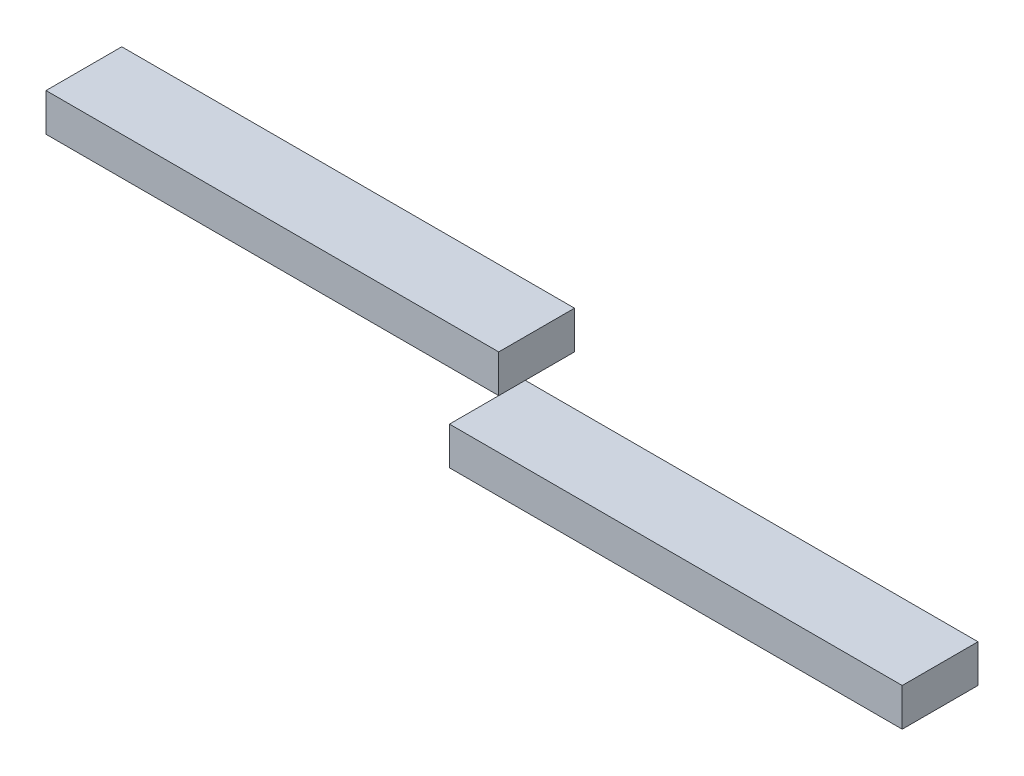
ISO-10303-21;
HEADER;
FILE_DESCRIPTION(('STEP AP214'),'2;1');
FILE_NAME('part.step','',(''),(''),'','','');
FILE_SCHEMA(('AUTOMOTIVE_DESIGN { 1 0 10303 214 1 1 1 1 }'));
ENDSEC;
DATA;
#1=APPLICATION_CONTEXT('core data for automotive mechanical design processes');
#2=APPLICATION_PROTOCOL_DEFINITION('international standard','automotive_design',2000,#1);
#3=PRODUCT_CONTEXT('',#1,'mechanical');
#4=PRODUCT('Part','Part','',(#3));
#5=PRODUCT_RELATED_PRODUCT_CATEGORY('part','',(#4));
#6=PRODUCT_DEFINITION_FORMATION('','',#4);
#7=PRODUCT_DEFINITION_CONTEXT('part definition',#1,'design');
#8=PRODUCT_DEFINITION('design','',#6,#7);
#9=PRODUCT_DEFINITION_SHAPE('','',#8);
#10=(LENGTH_UNIT() NAMED_UNIT(*) SI_UNIT(.MILLI.,.METRE.));
#11=(NAMED_UNIT(*) PLANE_ANGLE_UNIT() SI_UNIT($,.RADIAN.));
#12=(NAMED_UNIT(*) SI_UNIT($,.STERADIAN.) SOLID_ANGLE_UNIT());
#13=UNCERTAINTY_MEASURE_WITH_UNIT(LENGTH_MEASURE(1.E-05),#10,'distance_accuracy_value','');
#14=(GEOMETRIC_REPRESENTATION_CONTEXT(3) GLOBAL_UNCERTAINTY_ASSIGNED_CONTEXT((#13)) GLOBAL_UNIT_ASSIGNED_CONTEXT((#10,
#11,#12)) REPRESENTATION_CONTEXT('',''));
#15=CARTESIAN_POINT('',(0.,0.,0.));
#16=DIRECTION('',(0.,0.,1.));
#17=DIRECTION('',(1.,0.,0.));
#18=AXIS2_PLACEMENT_3D('',#15,#16,#17);
#19=CARTESIAN_POINT('',(-24.0201011300232,2.54,-8.68081744091279));
#20=DIRECTION('',(1.,0.,0.));
#21=DIRECTION('',(0.,0.,-1.));
#22=AXIS2_PLACEMENT_3D('',#19,#20,#21);
#23=PLANE('',#22);
#24=DIRECTION('',(0.,0.,1.));
#25=VECTOR('',#24,1.);
#26=CARTESIAN_POINT('',(-24.0201011300232,0.,-8.68081744091279));
#27=LINE('',#26,#25);
#28=CARTESIAN_POINT('',(-24.0201011300232,0.,-8.68081744091279));
#29=VERTEX_POINT('',#28);
#30=CARTESIAN_POINT('',(-24.0201011300232,0.,-3.60081744091279));
#31=VERTEX_POINT('',#30);
#32=EDGE_CURVE('E106',#29,#31,#27,.T.);
#33=ORIENTED_EDGE('',*,*,#32,.T.);
#34=DIRECTION('',(0.,-1.,0.));
#35=VECTOR('',#34,1.);
#36=CARTESIAN_POINT('',(-24.0201011300232,2.54,-3.60081744091279));
#37=LINE('',#36,#35);
#38=CARTESIAN_POINT('',(-24.0201011300232,2.54,-3.60081744091279));
#39=VERTEX_POINT('',#38);
#40=EDGE_CURVE('E12',#39,#31,#37,.T.);
#41=ORIENTED_EDGE('',*,*,#40,.F.);
#42=DIRECTION('',(0.,0.,1.));
#43=VECTOR('',#42,1.);
#44=CARTESIAN_POINT('',(-24.0201011300232,2.54,-8.68081744091279));
#45=LINE('',#44,#43);
#46=CARTESIAN_POINT('',(-24.0201011300232,2.54,-8.68081744091279));
#47=VERTEX_POINT('',#46);
#48=EDGE_CURVE('E94',#47,#39,#45,.T.);
#49=ORIENTED_EDGE('',*,*,#48,.F.);
#50=DIRECTION('',(0.,-1.,0.));
#51=VECTOR('',#50,1.);
#52=CARTESIAN_POINT('',(-24.0201011300232,2.54,-8.68081744091279));
#53=LINE('',#52,#51);
#54=EDGE_CURVE('E102',#47,#29,#53,.T.);
#55=ORIENTED_EDGE('',*,*,#54,.T.);
#56=EDGE_LOOP('',(#33,#41,#49,#55));
#57=FACE_BOUND('',#56,.T.);
#58=ADVANCED_FACE('F43',(#57),#23,.F.);
#59=CARTESIAN_POINT('',(-24.0201011300232,2.54,-3.60081744091279));
#60=DIRECTION('',(0.,0.,-1.));
#61=DIRECTION('',(-1.,0.,0.));
#62=AXIS2_PLACEMENT_3D('',#59,#60,#61);
#63=PLANE('',#62);
#64=DIRECTION('',(1.,0.,0.));
#65=VECTOR('',#64,1.);
#66=CARTESIAN_POINT('',(-24.0201011300232,0.,-3.60081744091279));
#67=LINE('',#66,#65);
#68=CARTESIAN_POINT('',(6.33289886997677,0.,-3.60081744091279));
#69=VERTEX_POINT('',#68);
#70=EDGE_CURVE('E98',#31,#69,#67,.T.);
#71=ORIENTED_EDGE('',*,*,#70,.T.);
#72=DIRECTION('',(0.,-1.,0.));
#73=VECTOR('',#72,1.);
#74=CARTESIAN_POINT('',(6.33289886997677,2.54,-3.60081744091279));
#75=LINE('',#74,#73);
#76=CARTESIAN_POINT('',(6.33289886997677,2.54,-3.60081744091279));
#77=VERTEX_POINT('',#76);
#78=EDGE_CURVE('E51',#77,#69,#75,.T.);
#79=ORIENTED_EDGE('',*,*,#78,.F.);
#80=DIRECTION('',(1.,0.,0.));
#81=VECTOR('',#80,1.);
#82=CARTESIAN_POINT('',(-24.0201011300232,2.54,-3.60081744091279));
#83=LINE('',#82,#81);
#84=EDGE_CURVE('E89',#39,#77,#83,.T.);
#85=ORIENTED_EDGE('',*,*,#84,.F.);
#86=ORIENTED_EDGE('',*,*,#40,.T.);
#87=EDGE_LOOP('',(#71,#79,#85,#86));
#88=FACE_BOUND('',#87,.T.);
#89=ADVANCED_FACE('F97',(#88),#63,.F.);
#90=CARTESIAN_POINT('',(6.33289886997677,2.54,-8.68081744091279));
#91=DIRECTION('',(-1.,0.,0.));
#92=DIRECTION('',(0.,0.,1.));
#93=AXIS2_PLACEMENT_3D('',#90,#91,#92);
#94=PLANE('',#93);
#95=DIRECTION('',(0.,0.,-1.));
#96=VECTOR('',#95,1.);
#97=CARTESIAN_POINT('',(6.33289886997677,0.,-8.68081744091279));
#98=LINE('',#97,#96);
#99=CARTESIAN_POINT('',(6.33289886997677,0.,-8.68081744091279));
#100=VERTEX_POINT('',#99);
#101=EDGE_CURVE('E76',#69,#100,#98,.T.);
#102=ORIENTED_EDGE('',*,*,#101,.T.);
#103=DIRECTION('',(0.,-1.,0.));
#104=VECTOR('',#103,1.);
#105=CARTESIAN_POINT('',(6.33289886997677,2.54,-8.68081744091279));
#106=LINE('',#105,#104);
#107=CARTESIAN_POINT('',(6.33289886997677,2.54,-8.68081744091279));
#108=VERTEX_POINT('',#107);
#109=EDGE_CURVE('E99',#108,#100,#106,.T.);
#110=ORIENTED_EDGE('',*,*,#109,.F.);
#111=DIRECTION('',(0.,0.,-1.));
#112=VECTOR('',#111,1.);
#113=CARTESIAN_POINT('',(6.33289886997677,2.54,-8.68081744091279));
#114=LINE('',#113,#112);
#115=EDGE_CURVE('E92',#77,#108,#114,.T.);
#116=ORIENTED_EDGE('',*,*,#115,.F.);
#117=ORIENTED_EDGE('',*,*,#78,.T.);
#118=EDGE_LOOP('',(#102,#110,#116,#117));
#119=FACE_BOUND('',#118,.T.);
#120=ADVANCED_FACE('F100',(#119),#94,.F.);
#121=CARTESIAN_POINT('',(-24.0201011300232,2.54,-8.68081744091279));
#122=DIRECTION('',(0.,0.,1.));
#123=DIRECTION('',(1.,0.,0.));
#124=AXIS2_PLACEMENT_3D('',#121,#122,#123);
#125=PLANE('',#124);
#126=DIRECTION('',(-1.,0.,0.));
#127=VECTOR('',#126,1.);
#128=CARTESIAN_POINT('',(-24.0201011300232,0.,-8.68081744091279));
#129=LINE('',#128,#127);
#130=EDGE_CURVE('E82',#100,#29,#129,.T.);
#131=ORIENTED_EDGE('',*,*,#130,.T.);
#132=ORIENTED_EDGE('',*,*,#54,.F.);
#133=DIRECTION('',(-1.,0.,0.));
#134=VECTOR('',#133,1.);
#135=CARTESIAN_POINT('',(-24.0201011300232,2.54,-8.68081744091279));
#136=LINE('',#135,#134);
#137=EDGE_CURVE('E59',#108,#47,#136,.T.);
#138=ORIENTED_EDGE('',*,*,#137,.F.);
#139=ORIENTED_EDGE('',*,*,#109,.T.);
#140=EDGE_LOOP('',(#131,#132,#138,#139));
#141=FACE_BOUND('',#140,.T.);
#142=ADVANCED_FACE('F113',(#141),#125,.F.);
#143=CARTESIAN_POINT('',(0.,2.54,0.));
#144=DIRECTION('',(0.,1.,0.));
#145=DIRECTION('',(0.,0.,1.));
#146=AXIS2_PLACEMENT_3D('',#143,#144,#145);
#147=PLANE('',#146);
#148=ORIENTED_EDGE('',*,*,#48,.T.);
#149=ORIENTED_EDGE('',*,*,#84,.T.);
#150=ORIENTED_EDGE('',*,*,#115,.T.);
#151=ORIENTED_EDGE('',*,*,#137,.T.);
#152=EDGE_LOOP('',(#148,#149,#150,#151));
#153=FACE_BOUND('',#152,.T.);
#154=ADVANCED_FACE('F90',(#153),#147,.T.);
#155=CARTESIAN_POINT('',(0.,0.,0.));
#156=DIRECTION('',(0.,1.,0.));
#157=DIRECTION('',(0.,0.,1.));
#158=AXIS2_PLACEMENT_3D('',#155,#156,#157);
#159=PLANE('',#158);
#160=ORIENTED_EDGE('',*,*,#32,.F.);
#161=ORIENTED_EDGE('',*,*,#130,.F.);
#162=ORIENTED_EDGE('',*,*,#101,.F.);
#163=ORIENTED_EDGE('',*,*,#70,.F.);
#164=EDGE_LOOP('',(#160,#161,#162,#163));
#165=FACE_BOUND('',#164,.T.);
#166=ADVANCED_FACE('F116',(#165),#159,.F.);
#167=CLOSED_SHELL('',(#58,#89,#120,#142,#154,#166));
#168=MANIFOLD_SOLID_BREP('B2',#167);
#169=CARTESIAN_POINT('',(-26.5601011300232,2.54,-9.4428174409128));
#170=DIRECTION('',(-1.,0.,0.));
#171=DIRECTION('',(0.,0.,1.));
#172=AXIS2_PLACEMENT_3D('',#169,#170,#171);
#173=PLANE('',#172);
#174=DIRECTION('',(0.,0.,-1.));
#175=VECTOR('',#174,1.);
#176=CARTESIAN_POINT('',(-26.5601011300232,0.,-9.4428174409128));
#177=LINE('',#176,#175);
#178=CARTESIAN_POINT('',(-26.5601011300232,0.,-9.4428174409128));
#179=VERTEX_POINT('',#178);
#180=CARTESIAN_POINT('',(-26.5601011300232,0.,-14.5228174409128));
#181=VERTEX_POINT('',#180);
#182=EDGE_CURVE('E230',#179,#181,#177,.T.);
#183=ORIENTED_EDGE('',*,*,#182,.T.);
#184=DIRECTION('',(0.,-1.,0.));
#185=VECTOR('',#184,1.);
#186=CARTESIAN_POINT('',(-26.5601011300232,2.54,-14.5228174409128));
#187=LINE('',#186,#185);
#188=CARTESIAN_POINT('',(-26.5601011300232,2.54,-14.5228174409128));
#189=VERTEX_POINT('',#188);
#190=EDGE_CURVE('E41',#189,#181,#187,.T.);
#191=ORIENTED_EDGE('',*,*,#190,.F.);
#192=DIRECTION('',(0.,0.,-1.));
#193=VECTOR('',#192,1.);
#194=CARTESIAN_POINT('',(-26.5601011300232,2.54,-9.4428174409128));
#195=LINE('',#194,#193);
#196=CARTESIAN_POINT('',(-26.5601011300232,2.54,-9.4428174409128));
#197=VERTEX_POINT('',#196);
#198=EDGE_CURVE('E218',#197,#189,#195,.T.);
#199=ORIENTED_EDGE('',*,*,#198,.F.);
#200=DIRECTION('',(0.,-1.,0.));
#201=VECTOR('',#200,1.);
#202=CARTESIAN_POINT('',(-26.5601011300232,2.54,-9.4428174409128));
#203=LINE('',#202,#201);
#204=EDGE_CURVE('E226',#197,#179,#203,.T.);
#205=ORIENTED_EDGE('',*,*,#204,.T.);
#206=EDGE_LOOP('',(#183,#191,#199,#205));
#207=FACE_BOUND('',#206,.T.);
#208=ADVANCED_FACE('F167',(#207),#173,.F.);
#209=CARTESIAN_POINT('',(-26.5601011300232,2.54,-14.5228174409128));
#210=DIRECTION('',(0.,0.,1.));
#211=DIRECTION('',(1.,0.,0.));
#212=AXIS2_PLACEMENT_3D('',#209,#210,#211);
#213=PLANE('',#212);
#214=DIRECTION('',(-1.,0.,0.));
#215=VECTOR('',#214,1.);
#216=CARTESIAN_POINT('',(-26.5601011300232,0.,-14.5228174409128));
#217=LINE('',#216,#215);
#218=CARTESIAN_POINT('',(-56.9131011300232,0.,-14.5228174409128));
#219=VERTEX_POINT('',#218);
#220=EDGE_CURVE('E222',#181,#219,#217,.T.);
#221=ORIENTED_EDGE('',*,*,#220,.T.);
#222=DIRECTION('',(0.,-1.,0.));
#223=VECTOR('',#222,1.);
#224=CARTESIAN_POINT('',(-56.9131011300232,2.54,-14.5228174409128));
#225=LINE('',#224,#223);
#226=CARTESIAN_POINT('',(-56.9131011300232,2.54,-14.5228174409128));
#227=VERTEX_POINT('',#226);
#228=EDGE_CURVE('E175',#227,#219,#225,.T.);
#229=ORIENTED_EDGE('',*,*,#228,.F.);
#230=DIRECTION('',(-1.,0.,0.));
#231=VECTOR('',#230,1.);
#232=CARTESIAN_POINT('',(-26.5601011300232,2.54,-14.5228174409128));
#233=LINE('',#232,#231);
#234=EDGE_CURVE('E213',#189,#227,#233,.T.);
#235=ORIENTED_EDGE('',*,*,#234,.F.);
#236=ORIENTED_EDGE('',*,*,#190,.T.);
#237=EDGE_LOOP('',(#221,#229,#235,#236));
#238=FACE_BOUND('',#237,.T.);
#239=ADVANCED_FACE('F221',(#238),#213,.F.);
#240=CARTESIAN_POINT('',(-56.9131011300232,2.54,-9.4428174409128));
#241=DIRECTION('',(1.,0.,0.));
#242=DIRECTION('',(0.,0.,-1.));
#243=AXIS2_PLACEMENT_3D('',#240,#241,#242);
#244=PLANE('',#243);
#245=DIRECTION('',(0.,0.,1.));
#246=VECTOR('',#245,1.);
#247=CARTESIAN_POINT('',(-56.9131011300232,0.,-9.4428174409128));
#248=LINE('',#247,#246);
#249=CARTESIAN_POINT('',(-56.9131011300232,0.,-9.4428174409128));
#250=VERTEX_POINT('',#249);
#251=EDGE_CURVE('E200',#219,#250,#248,.T.);
#252=ORIENTED_EDGE('',*,*,#251,.T.);
#253=DIRECTION('',(0.,-1.,0.));
#254=VECTOR('',#253,1.);
#255=CARTESIAN_POINT('',(-56.9131011300232,2.54,-9.4428174409128));
#256=LINE('',#255,#254);
#257=CARTESIAN_POINT('',(-56.9131011300232,2.54,-9.4428174409128));
#258=VERTEX_POINT('',#257);
#259=EDGE_CURVE('E223',#258,#250,#256,.T.);
#260=ORIENTED_EDGE('',*,*,#259,.F.);
#261=DIRECTION('',(0.,0.,1.));
#262=VECTOR('',#261,1.);
#263=CARTESIAN_POINT('',(-56.9131011300232,2.54,-9.4428174409128));
#264=LINE('',#263,#262);
#265=EDGE_CURVE('E216',#227,#258,#264,.T.);
#266=ORIENTED_EDGE('',*,*,#265,.F.);
#267=ORIENTED_EDGE('',*,*,#228,.T.);
#268=EDGE_LOOP('',(#252,#260,#266,#267));
#269=FACE_BOUND('',#268,.T.);
#270=ADVANCED_FACE('F224',(#269),#244,.F.);
#271=CARTESIAN_POINT('',(-26.5601011300232,2.54,-9.4428174409128));
#272=DIRECTION('',(0.,0.,-1.));
#273=DIRECTION('',(-1.,0.,0.));
#274=AXIS2_PLACEMENT_3D('',#271,#272,#273);
#275=PLANE('',#274);
#276=DIRECTION('',(1.,0.,0.));
#277=VECTOR('',#276,1.);
#278=CARTESIAN_POINT('',(-26.5601011300232,0.,-9.4428174409128));
#279=LINE('',#278,#277);
#280=EDGE_CURVE('E206',#250,#179,#279,.T.);
#281=ORIENTED_EDGE('',*,*,#280,.T.);
#282=ORIENTED_EDGE('',*,*,#204,.F.);
#283=DIRECTION('',(1.,0.,0.));
#284=VECTOR('',#283,1.);
#285=CARTESIAN_POINT('',(-26.5601011300232,2.54,-9.4428174409128));
#286=LINE('',#285,#284);
#287=EDGE_CURVE('E183',#258,#197,#286,.T.);
#288=ORIENTED_EDGE('',*,*,#287,.F.);
#289=ORIENTED_EDGE('',*,*,#259,.T.);
#290=EDGE_LOOP('',(#281,#282,#288,#289));
#291=FACE_BOUND('',#290,.T.);
#292=ADVANCED_FACE('F237',(#291),#275,.F.);
#293=CARTESIAN_POINT('',(0.,2.54,0.));
#294=DIRECTION('',(0.,1.,0.));
#295=DIRECTION('',(0.,0.,1.));
#296=AXIS2_PLACEMENT_3D('',#293,#294,#295);
#297=PLANE('',#296);
#298=ORIENTED_EDGE('',*,*,#198,.T.);
#299=ORIENTED_EDGE('',*,*,#234,.T.);
#300=ORIENTED_EDGE('',*,*,#265,.T.);
#301=ORIENTED_EDGE('',*,*,#287,.T.);
#302=EDGE_LOOP('',(#298,#299,#300,#301));
#303=FACE_BOUND('',#302,.T.);
#304=ADVANCED_FACE('F214',(#303),#297,.T.);
#305=CARTESIAN_POINT('',(0.,0.,0.));
#306=DIRECTION('',(0.,1.,0.));
#307=DIRECTION('',(0.,0.,1.));
#308=AXIS2_PLACEMENT_3D('',#305,#306,#307);
#309=PLANE('',#308);
#310=ORIENTED_EDGE('',*,*,#182,.F.);
#311=ORIENTED_EDGE('',*,*,#280,.F.);
#312=ORIENTED_EDGE('',*,*,#251,.F.);
#313=ORIENTED_EDGE('',*,*,#220,.F.);
#314=EDGE_LOOP('',(#310,#311,#312,#313));
#315=FACE_BOUND('',#314,.T.);
#316=ADVANCED_FACE('F240',(#315),#309,.F.);
#317=CLOSED_SHELL('',(#208,#239,#270,#292,#304,#316));
#318=MANIFOLD_SOLID_BREP('B6',#317);
#319=ADVANCED_BREP_SHAPE_REPRESENTATION('',(#18,#168,#318),#14);
#320=SHAPE_DEFINITION_REPRESENTATION(#9,#319);
ENDSEC;
END-ISO-10303-21;
